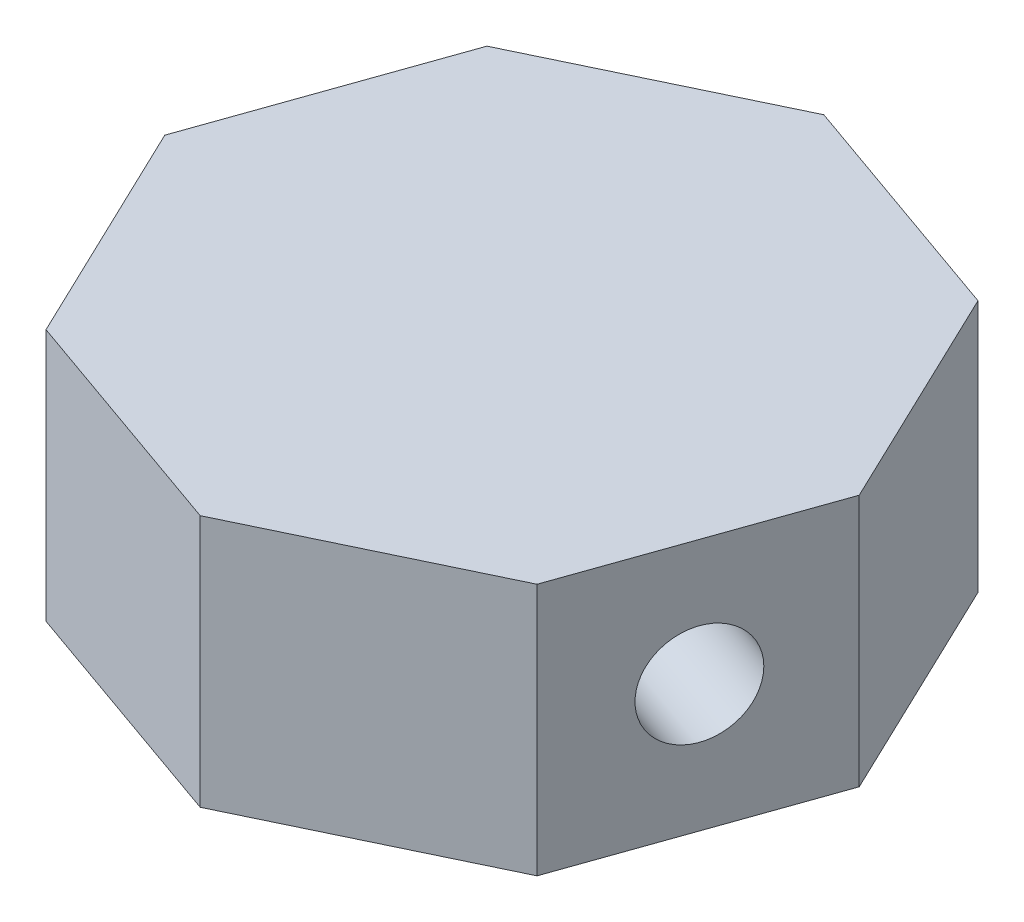
ISO-10303-21;
HEADER;
FILE_DESCRIPTION(('STEP AP214'),'2;1');
FILE_NAME('part.step','',(''),(''),'','','');
FILE_SCHEMA(('AUTOMOTIVE_DESIGN { 1 0 10303 214 1 1 1 1 }'));
ENDSEC;
DATA;
#1=APPLICATION_CONTEXT('core data for automotive mechanical design processes');
#2=APPLICATION_PROTOCOL_DEFINITION('international standard','automotive_design',2000,#1);
#3=PRODUCT_CONTEXT('',#1,'mechanical');
#4=PRODUCT('Part','Part','',(#3));
#5=PRODUCT_RELATED_PRODUCT_CATEGORY('part','',(#4));
#6=PRODUCT_DEFINITION_FORMATION('','',#4);
#7=PRODUCT_DEFINITION_CONTEXT('part definition',#1,'design');
#8=PRODUCT_DEFINITION('design','',#6,#7);
#9=PRODUCT_DEFINITION_SHAPE('','',#8);
#10=(LENGTH_UNIT() NAMED_UNIT(*) SI_UNIT(.MILLI.,.METRE.));
#11=(NAMED_UNIT(*) PLANE_ANGLE_UNIT() SI_UNIT($,.RADIAN.));
#12=(NAMED_UNIT(*) SI_UNIT($,.STERADIAN.) SOLID_ANGLE_UNIT());
#13=UNCERTAINTY_MEASURE_WITH_UNIT(LENGTH_MEASURE(1.E-05),#10,'distance_accuracy_value','');
#14=(GEOMETRIC_REPRESENTATION_CONTEXT(3) GLOBAL_UNCERTAINTY_ASSIGNED_CONTEXT((#13)) GLOBAL_UNIT_ASSIGNED_CONTEXT((#10,
#11,#12)) REPRESENTATION_CONTEXT('',''));
#15=CARTESIAN_POINT('',(0.,0.,0.));
#16=DIRECTION('',(0.,0.,1.));
#17=DIRECTION('',(1.,0.,0.));
#18=AXIS2_PLACEMENT_3D('',#15,#16,#17);
#19=CARTESIAN_POINT('',(0.0761144696809649,12.7,0.159024244647585));
#20=DIRECTION('',(-0.431729663393223,0.,-0.902003047526101));
#21=DIRECTION('',(-0.902003047526101,0.,0.431729663393223));
#22=AXIS2_PLACEMENT_3D('',#19,#20,#21);
#23=PLANE('',#22);
#24=DIRECTION('',(0.902003047526101,0.,-0.431729663393223));
#25=VECTOR('',#24,1.);
#26=CARTESIAN_POINT('',(0.0761144696809649,0.,0.159024244647585));
#27=LINE('',#26,#25);
#28=CARTESIAN_POINT('',(-10.842199515168,0.,5.38490461659165));
#29=VERTEX_POINT('',#28);
#30=CARTESIAN_POINT('',(0.613239188413443,0.,-0.0980621085022833));
#31=VERTEX_POINT('',#30);
#32=EDGE_CURVE('E140',#29,#31,#27,.T.);
#33=ORIENTED_EDGE('',*,*,#32,.T.);
#34=DIRECTION('',(0.,-1.,0.));
#35=VECTOR('',#34,1.);
#36=CARTESIAN_POINT('',(0.613239188413443,12.7,-0.0980621085022833));
#37=LINE('',#36,#35);
#38=CARTESIAN_POINT('',(0.613239188413443,12.7,-0.0980621085022833));
#39=VERTEX_POINT('',#38);
#40=EDGE_CURVE('E11',#39,#31,#37,.T.);
#41=ORIENTED_EDGE('',*,*,#40,.F.);
#42=DIRECTION('',(0.902003047526101,0.,-0.431729663393223));
#43=VECTOR('',#42,1.);
#44=CARTESIAN_POINT('',(0.0761144696809649,12.7,0.159024244647585));
#45=LINE('',#44,#43);
#46=CARTESIAN_POINT('',(-10.842199515168,12.7,5.38490461659165));
#47=VERTEX_POINT('',#46);
#48=EDGE_CURVE('E163',#47,#39,#45,.T.);
#49=ORIENTED_EDGE('',*,*,#48,.F.);
#50=DIRECTION('',(0.,-1.,0.));
#51=VECTOR('',#50,1.);
#52=CARTESIAN_POINT('',(-10.842199515168,12.7,5.38490461659165));
#53=LINE('',#52,#51);
#54=EDGE_CURVE('E136',#47,#29,#53,.T.);
#55=ORIENTED_EDGE('',*,*,#54,.T.);
#56=EDGE_LOOP('',(#33,#41,#49,#55));
#57=FACE_BOUND('',#56,.T.);
#58=ADVANCED_FACE('F39',(#57),#23,.F.);
#59=CARTESIAN_POINT('',(0.514674893105449,12.7,0.181474070274615));
#60=DIRECTION('',(-0.943091444181371,0.,-0.332533498931905));
#61=DIRECTION('',(-0.332533498931905,0.,0.943091444181372));
#62=AXIS2_PLACEMENT_3D('',#59,#60,#61);
#63=PLANE('',#62);
#64=CARTESIAN_POINT('',(2.74145897093073,6.4000162069479,-6.13386263589696));
#65=DIRECTION('',(0.943091444181372,0.,0.332533498931905));
#66=DIRECTION('',(0.332533498931905,0.,-0.943091444181372));
#67=AXIS2_PLACEMENT_3D('',#64,#65,#66);
#68=CIRCLE('',#67,2.54);
#69=CARTESIAN_POINT('',(3.58609405821777,6.4000162069479,-8.52931490411765));
#70=VERTEX_POINT('',#69);
#71=EDGE_CURVE('E207',#70,#70,#68,.T.);
#72=ORIENTED_EDGE('',*,*,#71,.F.);
#73=EDGE_LOOP('',(#72));
#74=FACE_BOUND('',#73,.T.);
#75=DIRECTION('',(0.332533498931905,0.,-0.943091444181372));
#76=VECTOR('',#75,1.);
#77=CARTESIAN_POINT('',(0.514674893105449,0.,0.181474070274615));
#78=LINE('',#77,#76);
#79=CARTESIAN_POINT('',(4.83641462484863,0.,-12.0753234496057));
#80=VERTEX_POINT('',#79);
#81=EDGE_CURVE('E144',#31,#80,#78,.T.);
#82=ORIENTED_EDGE('',*,*,#81,.T.);
#83=DIRECTION('',(0.,-1.,0.));
#84=VECTOR('',#83,1.);
#85=CARTESIAN_POINT('',(4.83641462484863,12.7,-12.0753234496057));
#86=LINE('',#85,#84);
#87=CARTESIAN_POINT('',(4.83641462484863,12.7,-12.0753234496057));
#88=VERTEX_POINT('',#87);
#89=EDGE_CURVE('E48',#88,#80,#86,.T.);
#90=ORIENTED_EDGE('',*,*,#89,.F.);
#91=DIRECTION('',(0.332533498931905,0.,-0.943091444181372));
#92=VECTOR('',#91,1.);
#93=CARTESIAN_POINT('',(0.514674893105449,12.7,0.181474070274615));
#94=LINE('',#93,#92);
#95=EDGE_CURVE('E99',#39,#88,#94,.T.);
#96=ORIENTED_EDGE('',*,*,#95,.F.);
#97=ORIENTED_EDGE('',*,*,#40,.T.);
#98=EDGE_LOOP('',(#82,#90,#96,#97));
#99=FACE_BOUND('',#98,.T.);
#100=ADVANCED_FACE('F245',(#74,#99),#63,.F.);
#101=CARTESIAN_POINT('',(8.63734310750178,12.7,-4.13412930548398));
#102=DIRECTION('',(-0.902003047526101,0.,0.431729663393223));
#103=DIRECTION('',(0.431729663393223,0.,0.902003047526101));
#104=AXIS2_PLACEMENT_3D('',#101,#102,#103);
#105=PLANE('',#104);
#106=DIRECTION('',(-0.431729663393223,0.,-0.902003047526101));
#107=VECTOR('',#106,1.);
#108=CARTESIAN_POINT('',(8.63734310750178,0.,-4.13412930548398));
#109=LINE('',#108,#107);
#110=CARTESIAN_POINT('',(-0.646552100245305,0.,-23.5307621531872));
#111=VERTEX_POINT('',#110);
#112=EDGE_CURVE('E148',#80,#111,#109,.T.);
#113=ORIENTED_EDGE('',*,*,#112,.T.);
#114=DIRECTION('',(0.,-1.,0.));
#115=VECTOR('',#114,1.);
#116=CARTESIAN_POINT('',(-0.646552100245305,12.7,-23.5307621531872));
#117=LINE('',#116,#115);
#118=CARTESIAN_POINT('',(-0.646552100245305,12.7,-23.5307621531872));
#119=VERTEX_POINT('',#118);
#120=EDGE_CURVE('E174',#119,#111,#117,.T.);
#121=ORIENTED_EDGE('',*,*,#120,.F.);
#122=DIRECTION('',(-0.431729663393223,0.,-0.902003047526101));
#123=VECTOR('',#122,1.);
#124=CARTESIAN_POINT('',(8.63734310750178,12.7,-4.13412930548398));
#125=LINE('',#124,#123);
#126=EDGE_CURVE('E184',#88,#119,#125,.T.);
#127=ORIENTED_EDGE('',*,*,#126,.F.);
#128=ORIENTED_EDGE('',*,*,#89,.T.);
#129=EDGE_LOOP('',(#113,#121,#127,#128));
#130=FACE_BOUND('',#129,.T.);
#131=ADVANCED_FACE('F182',(#130),#105,.F.);
#132=CARTESIAN_POINT('',(7.30797572098695,12.7,-20.726000234218));
#133=DIRECTION('',(-0.332533498931904,0.,0.943091444181372));
#134=DIRECTION('',(0.943091444181372,0.,0.332533498931904));
#135=AXIS2_PLACEMENT_3D('',#132,#133,#134);
#136=PLANE('',#135);
#137=DIRECTION('',(-0.943091444181372,0.,-0.332533498931904));
#138=VECTOR('',#137,1.);
#139=CARTESIAN_POINT('',(7.30797572098695,0.,-20.726000234218));
#140=LINE('',#139,#138);
#141=CARTESIAN_POINT('',(-12.6238134413487,0.,-27.7539375896224));
#142=VERTEX_POINT('',#141);
#143=EDGE_CURVE('E151',#111,#142,#140,.T.);
#144=ORIENTED_EDGE('',*,*,#143,.T.);
#145=DIRECTION('',(0.,-1.,0.));
#146=VECTOR('',#145,1.);
#147=CARTESIAN_POINT('',(-12.6238134413487,12.7,-27.7539375896224));
#148=LINE('',#147,#146);
#149=CARTESIAN_POINT('',(-12.6238134413487,12.7,-27.7539375896224));
#150=VERTEX_POINT('',#149);
#151=EDGE_CURVE('E170',#150,#142,#148,.T.);
#152=ORIENTED_EDGE('',*,*,#151,.F.);
#153=DIRECTION('',(-0.943091444181372,0.,-0.332533498931904));
#154=VECTOR('',#153,1.);
#155=CARTESIAN_POINT('',(7.30797572098695,12.7,-20.726000234218));
#156=LINE('',#155,#154);
#157=EDGE_CURVE('E197',#119,#150,#156,.T.);
#158=ORIENTED_EDGE('',*,*,#157,.F.);
#159=ORIENTED_EDGE('',*,*,#120,.T.);
#160=EDGE_LOOP('',(#144,#152,#158,#159));
#161=FACE_BOUND('',#160,.T.);
#162=ADVANCED_FACE('F192',(#161),#136,.F.);
#163=CARTESIAN_POINT('',(-13.1609381600812,12.7,-27.4968512364725));
#164=DIRECTION('',(0.431729663393223,0.,0.902003047526101));
#165=DIRECTION('',(0.902003047526101,0.,-0.431729663393223));
#166=AXIS2_PLACEMENT_3D('',#163,#164,#165);
#167=PLANE('',#166);
#168=DIRECTION('',(-0.902003047526101,0.,0.431729663393223));
#169=VECTOR('',#168,1.);
#170=CARTESIAN_POINT('',(-13.1609381600812,0.,-27.4968512364725));
#171=LINE('',#170,#169);
#172=CARTESIAN_POINT('',(-24.0792521449302,0.,-22.2709708645284));
#173=VERTEX_POINT('',#172);
#174=EDGE_CURVE('E154',#142,#173,#171,.T.);
#175=ORIENTED_EDGE('',*,*,#174,.T.);
#176=DIRECTION('',(0.,-1.,0.));
#177=VECTOR('',#176,1.);
#178=CARTESIAN_POINT('',(-24.0792521449302,12.7,-22.2709708645284));
#179=LINE('',#178,#177);
#180=CARTESIAN_POINT('',(-24.0792521449302,12.7,-22.2709708645284));
#181=VERTEX_POINT('',#180);
#182=EDGE_CURVE('E129',#181,#173,#179,.T.);
#183=ORIENTED_EDGE('',*,*,#182,.F.);
#184=DIRECTION('',(-0.902003047526101,0.,0.431729663393223));
#185=VECTOR('',#184,1.);
#186=CARTESIAN_POINT('',(-13.1609381600812,12.7,-27.4968512364725));
#187=LINE('',#186,#185);
#188=EDGE_CURVE('E118',#150,#181,#187,.T.);
#189=ORIENTED_EDGE('',*,*,#188,.F.);
#190=ORIENTED_EDGE('',*,*,#151,.T.);
#191=EDGE_LOOP('',(#175,#183,#189,#190));
#192=FACE_BOUND('',#191,.T.);
#193=ADVANCED_FACE('F195',(#192),#167,.F.);
#194=CARTESIAN_POINT('',(-28.4009918766734,12.7,-10.0141733446481));
#195=DIRECTION('',(0.943091444181372,0.,0.332533498931904));
#196=DIRECTION('',(0.332533498931904,0.,-0.943091444181372));
#197=AXIS2_PLACEMENT_3D('',#194,#195,#196);
#198=PLANE('',#197);
#199=DIRECTION('',(-0.332533498931904,0.,0.943091444181372));
#200=VECTOR('',#199,1.);
#201=CARTESIAN_POINT('',(-28.4009918766734,0.,-10.0141733446481));
#202=LINE('',#201,#200);
#203=CARTESIAN_POINT('',(-28.3024275813654,0.,-10.293709523425));
#204=VERTEX_POINT('',#203);
#205=EDGE_CURVE('E127',#173,#204,#202,.T.);
#206=ORIENTED_EDGE('',*,*,#205,.T.);
#207=DIRECTION('',(0.,-1.,0.));
#208=VECTOR('',#207,1.);
#209=CARTESIAN_POINT('',(-28.3024275813654,12.7,-10.293709523425));
#210=LINE('',#209,#208);
#211=CARTESIAN_POINT('',(-28.3024275813654,12.7,-10.293709523425));
#212=VERTEX_POINT('',#211);
#213=EDGE_CURVE('E124',#212,#204,#210,.T.);
#214=ORIENTED_EDGE('',*,*,#213,.F.);
#215=DIRECTION('',(-0.332533498931904,0.,0.943091444181372));
#216=VECTOR('',#215,1.);
#217=CARTESIAN_POINT('',(-28.4009918766734,12.7,-10.0141733446481));
#218=LINE('',#217,#216);
#219=EDGE_CURVE('E112',#181,#212,#218,.T.);
#220=ORIENTED_EDGE('',*,*,#219,.F.);
#221=ORIENTED_EDGE('',*,*,#182,.T.);
#222=EDGE_LOOP('',(#206,#214,#220,#221));
#223=FACE_BOUND('',#222,.T.);
#224=ADVANCED_FACE('F125',(#223),#198,.F.);
#225=CARTESIAN_POINT('',(-19.0185323736183,12.7,9.10292332427818));
#226=DIRECTION('',(0.902003047526101,0.,-0.431729663393223));
#227=DIRECTION('',(-0.431729663393223,0.,-0.902003047526101));
#228=AXIS2_PLACEMENT_3D('',#225,#226,#227);
#229=PLANE('',#228);
#230=DIRECTION('',(0.431729663393223,0.,0.902003047526101));
#231=VECTOR('',#230,1.);
#232=CARTESIAN_POINT('',(-19.0185323736183,0.,9.10292332427818));
#233=LINE('',#232,#231);
#234=CARTESIAN_POINT('',(-22.8194608562715,0.,1.16172918015647));
#235=VERTEX_POINT('',#234);
#236=EDGE_CURVE('E85',#204,#235,#233,.T.);
#237=ORIENTED_EDGE('',*,*,#236,.T.);
#238=DIRECTION('',(0.,-1.,0.));
#239=VECTOR('',#238,1.);
#240=CARTESIAN_POINT('',(-22.8194608562715,12.7,1.16172918015647));
#241=LINE('',#240,#239);
#242=CARTESIAN_POINT('',(-22.8194608562715,12.7,1.16172918015647));
#243=VERTEX_POINT('',#242);
#244=EDGE_CURVE('E130',#243,#235,#241,.T.);
#245=ORIENTED_EDGE('',*,*,#244,.F.);
#246=DIRECTION('',(0.431729663393223,0.,0.902003047526101));
#247=VECTOR('',#246,1.);
#248=CARTESIAN_POINT('',(-19.0185323736183,12.7,9.10292332427818));
#249=LINE('',#248,#247);
#250=EDGE_CURVE('E116',#212,#243,#249,.T.);
#251=ORIENTED_EDGE('',*,*,#250,.F.);
#252=ORIENTED_EDGE('',*,*,#213,.T.);
#253=EDGE_LOOP('',(#237,#245,#251,#252));
#254=FACE_BOUND('',#253,.T.);
#255=ADVANCED_FACE('F132',(#254),#229,.F.);
#256=CARTESIAN_POINT('',(-2.88767169393578,12.7,8.18966653556081));
#257=DIRECTION('',(0.332533498931904,0.,-0.943091444181372));
#258=DIRECTION('',(-0.943091444181372,0.,-0.332533498931904));
#259=AXIS2_PLACEMENT_3D('',#256,#257,#258);
#260=PLANE('',#259);
#261=DIRECTION('',(0.943091444181372,0.,0.332533498931904));
#262=VECTOR('',#261,1.);
#263=CARTESIAN_POINT('',(-2.88767169393578,0.,8.18966653556081));
#264=LINE('',#263,#262);
#265=EDGE_CURVE('E91',#235,#29,#264,.T.);
#266=ORIENTED_EDGE('',*,*,#265,.T.);
#267=ORIENTED_EDGE('',*,*,#54,.F.);
#268=DIRECTION('',(0.943091444181372,0.,0.332533498931904));
#269=VECTOR('',#268,1.);
#270=CARTESIAN_POINT('',(-2.88767169393578,12.7,8.18966653556081));
#271=LINE('',#270,#269);
#272=EDGE_CURVE('E56',#243,#47,#271,.T.);
#273=ORIENTED_EDGE('',*,*,#272,.F.);
#274=ORIENTED_EDGE('',*,*,#244,.T.);
#275=EDGE_LOOP('',(#266,#267,#273,#274));
#276=FACE_BOUND('',#275,.T.);
#277=ADVANCED_FACE('F241',(#276),#260,.F.);
#278=CARTESIAN_POINT('',(0.,12.7,0.));
#279=DIRECTION('',(0.,1.,0.));
#280=DIRECTION('',(0.,0.,1.));
#281=AXIS2_PLACEMENT_3D('',#278,#279,#280);
#282=PLANE('',#281);
#283=ORIENTED_EDGE('',*,*,#48,.T.);
#284=ORIENTED_EDGE('',*,*,#95,.T.);
#285=ORIENTED_EDGE('',*,*,#126,.T.);
#286=ORIENTED_EDGE('',*,*,#157,.T.);
#287=ORIENTED_EDGE('',*,*,#188,.T.);
#288=ORIENTED_EDGE('',*,*,#219,.T.);
#289=ORIENTED_EDGE('',*,*,#250,.T.);
#290=ORIENTED_EDGE('',*,*,#272,.T.);
#291=EDGE_LOOP('',(#283,#284,#285,#286,#287,#288,#289,#290));
#292=FACE_BOUND('',#291,.T.);
#293=ADVANCED_FACE('F114',(#292),#282,.T.);
#294=CARTESIAN_POINT('',(0.,0.,0.));
#295=DIRECTION('',(0.,1.,0.));
#296=DIRECTION('',(0.,0.,1.));
#297=AXIS2_PLACEMENT_3D('',#294,#295,#296);
#298=PLANE('',#297);
#299=CARTESIAN_POINT('',(-11.7822758869679,0.,-11.1609344539534));
#300=DIRECTION('',(0.,-1.,0.));
#301=DIRECTION('',(0.,0.,-1.));
#302=AXIS2_PLACEMENT_3D('',#299,#300,#301);
#303=CIRCLE('',#302,3.175);
#304=CARTESIAN_POINT('',(-11.7822758869679,0.,-14.3359344539534));
#305=VERTEX_POINT('',#304);
#306=EDGE_CURVE('E215',#305,#305,#303,.T.);
#307=ORIENTED_EDGE('',*,*,#306,.F.);
#308=EDGE_LOOP('',(#307));
#309=FACE_BOUND('',#308,.T.);
#310=ORIENTED_EDGE('',*,*,#32,.F.);
#311=ORIENTED_EDGE('',*,*,#265,.F.);
#312=ORIENTED_EDGE('',*,*,#236,.F.);
#313=ORIENTED_EDGE('',*,*,#205,.F.);
#314=ORIENTED_EDGE('',*,*,#174,.F.);
#315=ORIENTED_EDGE('',*,*,#143,.F.);
#316=ORIENTED_EDGE('',*,*,#112,.F.);
#317=ORIENTED_EDGE('',*,*,#81,.F.);
#318=EDGE_LOOP('',(#310,#311,#312,#313,#314,#315,#316,#317));
#319=FACE_BOUND('',#318,.T.);
#320=ADVANCED_FACE('F188',(#309,#319),#298,.F.);
#321=CARTESIAN_POINT('',(-9.23580237017269,6.4000162069479,-10.3570380723322));
#322=DIRECTION('',(0.943091444181371,0.,0.332533498931905));
#323=DIRECTION('',(0.332533498931905,0.,-0.943091444181371));
#324=AXIS2_PLACEMENT_3D('',#321,#322,#323);
#325=CYLINDRICAL_SURFACE('',#324,2.54);
#326=CARTESIAN_POINT('',(-9.23580237017269,6.4000162069479,-10.3570380723322));
#327=DIRECTION('',(0.943091444181372,0.,0.332533498931905));
#328=DIRECTION('',(0.332533498931905,0.,-0.943091444181372));
#329=AXIS2_PLACEMENT_3D('',#326,#327,#328);
#330=CIRCLE('',#329,2.54);
#331=CARTESIAN_POINT('',(-8.39116728288565,6.4000162069479,-12.7524903405528));
#332=VERTEX_POINT('',#331);
#333=EDGE_CURVE('E145',#332,#332,#330,.T.);
#334=ORIENTED_EDGE('',*,*,#333,.F.);
#335=EDGE_LOOP('',(#334));
#336=FACE_BOUND('',#335,.T.);
#337=ORIENTED_EDGE('',*,*,#71,.T.);
#338=EDGE_LOOP('',(#337));
#339=FACE_BOUND('',#338,.T.);
#340=ADVANCED_FACE('F233',(#336,#339),#325,.F.);
#341=CARTESIAN_POINT('',(-11.462586447998,0.,-4.04170136616057));
#342=DIRECTION('',(0.943091444181372,0.,0.332533498931905));
#343=DIRECTION('',(0.332533498931905,0.,-0.943091444181372));
#344=AXIS2_PLACEMENT_3D('',#341,#342,#343);
#345=PLANE('',#344);
#346=ORIENTED_EDGE('',*,*,#333,.T.);
#347=EDGE_LOOP('',(#346));
#348=FACE_BOUND('',#347,.T.);
#349=ADVANCED_FACE('F228',(#348),#345,.T.);
#350=CARTESIAN_POINT('',(-11.7822758869679,2.54,-11.1609344539534));
#351=DIRECTION('',(0.,-1.,0.));
#352=DIRECTION('',(0.,0.,-1.));
#353=AXIS2_PLACEMENT_3D('',#350,#351,#352);
#354=CYLINDRICAL_SURFACE('',#353,3.175);
#355=CARTESIAN_POINT('',(-11.7822758869679,2.54,-11.1609344539534));
#356=DIRECTION('',(0.,-1.,0.));
#357=DIRECTION('',(0.,0.,-1.));
#358=AXIS2_PLACEMENT_3D('',#355,#356,#357);
#359=CIRCLE('',#358,3.175);
#360=CARTESIAN_POINT('',(-11.7822758869679,2.54,-14.3359344539534));
#361=VERTEX_POINT('',#360);
#362=EDGE_CURVE('E211',#361,#361,#359,.T.);
#363=ORIENTED_EDGE('',*,*,#362,.F.);
#364=EDGE_LOOP('',(#363));
#365=FACE_BOUND('',#364,.T.);
#366=ORIENTED_EDGE('',*,*,#306,.T.);
#367=EDGE_LOOP('',(#366));
#368=FACE_BOUND('',#367,.T.);
#369=ADVANCED_FACE('F225',(#365,#368),#354,.F.);
#370=CARTESIAN_POINT('',(0.,2.54,0.));
#371=DIRECTION('',(0.,-1.,0.));
#372=DIRECTION('',(0.,0.,-1.));
#373=AXIS2_PLACEMENT_3D('',#370,#371,#372);
#374=PLANE('',#373);
#375=ORIENTED_EDGE('',*,*,#362,.T.);
#376=EDGE_LOOP('',(#375));
#377=FACE_BOUND('',#376,.T.);
#378=ADVANCED_FACE('F223',(#377),#374,.T.);
#379=CLOSED_SHELL('',(#58,#100,#131,#162,#193,#224,#255,#277,#293,#320,#340,#349,#369,#378));
#380=MANIFOLD_SOLID_BREP('B2',#379);
#381=ADVANCED_BREP_SHAPE_REPRESENTATION('',(#18,#380),#14);
#382=SHAPE_DEFINITION_REPRESENTATION(#9,#381);
ENDSEC;
END-ISO-10303-21;
